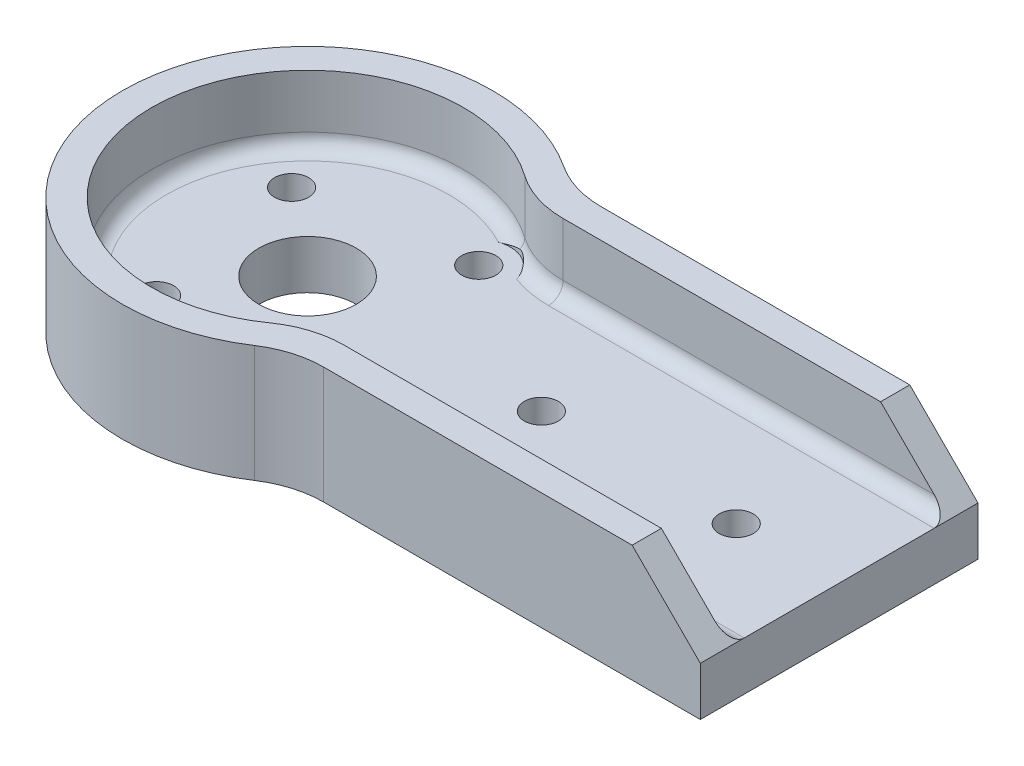
ISO-10303-21;
HEADER;
FILE_DESCRIPTION(('STEP AP214'),'2;1');
FILE_NAME('part.step','',(''),(''),'','','');
FILE_SCHEMA(('AUTOMOTIVE_DESIGN { 1 0 10303 214 1 1 1 1 }'));
ENDSEC;
DATA;
#1=APPLICATION_CONTEXT('core data for automotive mechanical design processes');
#2=APPLICATION_PROTOCOL_DEFINITION('international standard','automotive_design',2000,#1);
#3=PRODUCT_CONTEXT('',#1,'mechanical');
#4=PRODUCT('Part','Part','',(#3));
#5=PRODUCT_RELATED_PRODUCT_CATEGORY('part','',(#4));
#6=PRODUCT_DEFINITION_FORMATION('','',#4);
#7=PRODUCT_DEFINITION_CONTEXT('part definition',#1,'design');
#8=PRODUCT_DEFINITION('design','',#6,#7);
#9=PRODUCT_DEFINITION_SHAPE('','',#8);
#10=(LENGTH_UNIT() NAMED_UNIT(*) SI_UNIT(.MILLI.,.METRE.));
#11=(NAMED_UNIT(*) PLANE_ANGLE_UNIT() SI_UNIT($,.RADIAN.));
#12=(NAMED_UNIT(*) SI_UNIT($,.STERADIAN.) SOLID_ANGLE_UNIT());
#13=UNCERTAINTY_MEASURE_WITH_UNIT(LENGTH_MEASURE(1.E-05),#10,'distance_accuracy_value','');
#14=(GEOMETRIC_REPRESENTATION_CONTEXT(3) GLOBAL_UNCERTAINTY_ASSIGNED_CONTEXT((#13)) GLOBAL_UNIT_ASSIGNED_CONTEXT((#10,
#11,#12)) REPRESENTATION_CONTEXT('',''));
#15=CARTESIAN_POINT('',(0.,0.,0.));
#16=DIRECTION('',(0.,0.,1.));
#17=DIRECTION('',(1.,0.,0.));
#18=AXIS2_PLACEMENT_3D('',#15,#16,#17);
#19=CARTESIAN_POINT('',(14.9812382665787,6.5,-21.25));
#20=DIRECTION('',(0.,1.,0.));
#21=DIRECTION('',(0.,0.,1.));
#22=AXIS2_PLACEMENT_3D('',#19,#20,#21);
#23=TOROIDAL_SURFACE('',#22,11.5,1.5);
#24=CARTESIAN_POINT('',(11.0722439174272,5.14642049521173,-9.7498));
#25=CARTESIAN_POINT('',(11.0722551961008,5.12817830638219,-9.79011848867546));
#26=CARTESIAN_POINT('',(11.0714989703206,5.11171195343398,-9.83122690485633));
#27=CARTESIAN_POINT('',(11.0683393576506,5.08229249876614,-9.91458229134633));
#28=CARTESIAN_POINT('',(11.0659374034548,5.06933635490204,-9.9568282406654));
#29=CARTESIAN_POINT('',(11.0594020149385,5.04696123557071,-10.0417326809035));
#30=CARTESIAN_POINT('',(11.0552832170315,5.0375136073061,-10.0843847746103));
#31=CARTESIAN_POINT('',(11.0452714001229,5.0218686331396,-10.1700699045475));
#32=CARTESIAN_POINT('',(11.0393780799411,5.0156718394747,-10.2131030042398));
#33=CARTESIAN_POINT('',(11.0190493711127,5.00173391205888,-10.341989855795));
#34=CARTESIAN_POINT('',(11.0019409437119,4.99856323056397,-10.4279569643731));
#35=CARTESIAN_POINT('',(10.9608930637599,5.00262134556448,-10.5979860009344));
#36=CARTESIAN_POINT('',(10.9369431975972,5.00986606404966,-10.6820448120496));
#37=CARTESIAN_POINT('',(10.8663466825386,5.03961882302558,-10.8968699424602));
#38=CARTESIAN_POINT('',(10.8147388852321,5.06871370867024,-11.0250903522654));
#39=CARTESIAN_POINT('',(10.6974210901145,5.14041657930096,-11.2714120830588));
#40=CARTESIAN_POINT('',(10.6316279304076,5.18310499244215,-11.3894477218864));
#41=CARTESIAN_POINT('',(10.5101496453275,5.25991035197583,-11.5792132850456));
#42=CARTESIAN_POINT('',(10.4578366477459,5.29247527858474,-11.653792461489));
#43=CARTESIAN_POINT('',(10.3471221501715,5.35782441905683,-11.7983638600736));
#44=CARTESIAN_POINT('',(10.2887135259105,5.3906088466381,-11.8683505556427));
#45=CARTESIAN_POINT('',(10.1660189116357,5.45295263948425,-12.0033250331124));
#46=CARTESIAN_POINT('',(10.1017874798383,5.48253719671397,-12.0683504599357));
#47=CARTESIAN_POINT('',(9.96653784784571,5.53465825490824,-12.1939664263962));
#48=CARTESIAN_POINT('',(9.89553516640354,5.55721038931196,-12.2545665704557));
#49=CARTESIAN_POINT('',(9.77998752670991,5.58305414062454,-12.3447005082925));
#50=CARTESIAN_POINT('',(9.73776815005479,5.59044991783461,-12.3760342114577));
#51=CARTESIAN_POINT('',(9.65148982459086,5.60093791997458,-12.4368460519725));
#52=CARTESIAN_POINT('',(9.60743126557728,5.60403105208264,-12.4663245792193));
#53=CARTESIAN_POINT('',(9.51789020273415,5.60558561008889,-12.5231013747702));
#54=CARTESIAN_POINT('',(9.47240868663771,5.60405018124155,-12.5504011106896));
#55=CARTESIAN_POINT('',(9.3804511586046,5.59652680816897,-12.6025935933562));
#56=CARTESIAN_POINT('',(9.33397493014128,5.59053788474388,-12.6274858093963));
#57=CARTESIAN_POINT('',(9.16570651330277,5.56198765392071,-12.7124495837585));
#58=CARTESIAN_POINT('',(9.04210870517434,5.52823237926301,-12.7652532407224));
#59=CARTESIAN_POINT('',(8.85552543309019,5.46848038355663,-12.832087263231));
#60=CARTESIAN_POINT('',(8.79294423479313,5.44696503302771,-12.8523452339336));
#61=CARTESIAN_POINT('',(8.66718558265509,5.40234605226796,-12.8889242084795));
#62=CARTESIAN_POINT('',(8.60400844764643,5.37924323390982,-12.9052472057953));
#63=CARTESIAN_POINT('',(8.50963078771791,5.34463746514874,-12.9266335967279));
#64=CARTESIAN_POINT('',(8.47869548929778,5.33327956124583,-12.9331702714396));
#65=CARTESIAN_POINT('',(8.4167813307866,5.310642379409,-12.9453112585071));
#66=CARTESIAN_POINT('',(8.38580333205275,5.29936298063533,-12.9509197383446));
#67=CARTESIAN_POINT('',(8.35472134097655,5.28815366217246,-12.9560829371624));
#68=B_SPLINE_CURVE_WITH_KNOTS('',3,(#24,#25,#26,#27,#28,#29,#30,#31,#32,#33,#34,#35,#36,#37,#38,
#39,#40,#41,#42,#43,#44,#45,#46,#47,#48,#49,#50,#51,#52,#53,#54,#55,#56,#57,#58,#59,#60,#61,#62,
#63,#64,#65,#66,#67),.UNSPECIFIED.,.F.,.F.,(4,2,2,2,2,2,2,2,2,2,2,2,2,2,2,2,2,2,2,2,2,4),(0.,
0.132692918334424,0.265270466970811,0.39674016360757,0.528232186491525,0.790218054714842,
1.05260484603921,1.47390875747717,1.89775319815351,2.18771095243267,2.47801147304167,
2.76582836544833,3.05300078788183,3.21207751632181,3.3711206996254,3.53005583239267,
3.68902592092127,4.1017419984032,4.30934594532941,4.51684449723854,4.61762553058057,
4.7179410146354),.UNSPECIFIED.);
#69=CARTESIAN_POINT('',(10.9928998139801,5.,-10.4637515146589));
#70=VERTEX_POINT('',#69);
#71=CARTESIAN_POINT('',(9.00725589943939,5.51598613365082,-12.7762595092081));
#72=VERTEX_POINT('',#71);
#73=EDGE_CURVE('E159',#70,#72,#68,.T.);
#74=ORIENTED_EDGE('',*,*,#73,.F.);
#75=CARTESIAN_POINT('',(14.9812382665787,5.,-21.25));
#76=DIRECTION('',(0.,1.,0.));
#77=DIRECTION('',(0.,0.,1.));
#78=AXIS2_PLACEMENT_3D('',#75,#76,#77);
#79=CIRCLE('',#78,11.5);
#80=CARTESIAN_POINT('',(14.9812382665787,5.,-9.74999999999999));
#81=VERTEX_POINT('',#80);
#82=EDGE_CURVE('E170',#81,#70,#79,.F.);
#83=ORIENTED_EDGE('',*,*,#82,.F.);
#84=CARTESIAN_POINT('',(14.9812382665787,6.5,-9.74999999999999));
#85=DIRECTION('',(1.,0.,0.));
#86=DIRECTION('',(0.,0.,-1.));
#87=AXIS2_PLACEMENT_3D('',#84,#85,#86);
#88=CIRCLE('',#87,1.5);
#89=CARTESIAN_POINT('',(14.9812382665787,6.5,-11.25));
#90=VERTEX_POINT('',#89);
#91=EDGE_CURVE('E207',#81,#90,#88,.T.);
#92=ORIENTED_EDGE('',*,*,#91,.T.);
#93=CARTESIAN_POINT('',(14.9812382665787,6.5,-21.25));
#94=DIRECTION('',(0.,1.,0.));
#95=DIRECTION('',(0.,0.,1.));
#96=AXIS2_PLACEMENT_3D('',#93,#94,#95);
#97=CIRCLE('',#96,10.);
#98=CARTESIAN_POINT('',(9.21922354866378,6.5,-13.0769230769231));
#99=VERTEX_POINT('',#98);
#100=EDGE_CURVE('E196',#99,#90,#97,.T.);
#101=ORIENTED_EDGE('',*,*,#100,.F.);
#102=CARTESIAN_POINT('',(8.35492134097656,6.5,-11.8509615384615));
#103=DIRECTION('',(0.817307692307692,0.,0.576201471791487));
#104=DIRECTION('',(0.576201471791487,0.,-0.817307692307692));
#105=AXIS2_PLACEMENT_3D('',#102,#103,#104);
#106=CIRCLE('',#105,1.5);
#107=EDGE_CURVE('E172',#72,#99,#106,.T.);
#108=ORIENTED_EDGE('',*,*,#107,.F.);
#109=EDGE_LOOP('',(#74,#83,#92,#101,#108));
#110=FACE_BOUND('',#109,.T.);
#111=ADVANCED_FACE('F37',(#110),#23,.F.);
#112=CARTESIAN_POINT('',(0.,6.5,0.));
#113=DIRECTION('',(0.,1.,0.));
#114=DIRECTION('',(0.,0.,1.));
#115=AXIS2_PLACEMENT_3D('',#112,#113,#114);
#116=TOROIDAL_SURFACE('',#115,14.5,1.5);
#117=CARTESIAN_POINT('',(9.21942354866379,5.57507245928089,-12.684346451129));
#118=CARTESIAN_POINT('',(9.13786806168468,5.55389722238251,-12.7231588761133));
#119=CARTESIAN_POINT('',(9.05527810348355,5.53039346014796,-12.7583334001135));
#120=CARTESIAN_POINT('',(8.88828375072956,5.48051888445208,-12.8214905016335));
#121=CARTESIAN_POINT('',(8.80388047333892,5.45414979781876,-12.8494773770551));
#122=CARTESIAN_POINT('',(8.63243942496505,5.39999654672392,-12.8986694487097));
#123=CARTESIAN_POINT('',(8.54538255121528,5.37219963286265,-12.9197932906835));
#124=CARTESIAN_POINT('',(8.36971709543827,5.31689036436951,-12.9548083169053));
#125=CARTESIAN_POINT('',(8.28110826076299,5.28937805725119,-12.9686983120083));
#126=CARTESIAN_POINT('',(8.09980622387119,5.23509011428343,-12.9894502947654));
#127=CARTESIAN_POINT('',(8.00707148728976,5.20836362935777,-12.996081470544));
#128=CARTESIAN_POINT('',(7.82053075861663,5.15790381461554,-13.001338718818));
#129=CARTESIAN_POINT('',(7.72672458098127,5.13417101206152,-12.9999633831716));
#130=CARTESIAN_POINT('',(7.5390695211161,5.09121633791186,-12.9889958056236));
#131=CARTESIAN_POINT('',(7.44522364073335,5.0719706553163,-12.9794482538247));
#132=CARTESIAN_POINT('',(7.25778302429744,5.03936684803771,-12.9520067286634));
#133=CARTESIAN_POINT('',(7.16418814350747,5.02600379181012,-12.9341197724258));
#134=CARTESIAN_POINT('',(6.9639789599477,5.00541951697016,-12.8865589014567));
#135=CARTESIAN_POINT('',(6.85754977824341,4.99944169278959,-12.8555059481958));
#136=CARTESIAN_POINT('',(6.6484679716934,5.00063858857448,-12.7826489634635));
#137=CARTESIAN_POINT('',(6.54581187438802,5.00780088965887,-12.7408551154328));
#138=CARTESIAN_POINT('',(6.36348673916811,5.03597290931549,-12.6556740430819));
#139=CARTESIAN_POINT('',(6.28280369186867,5.05452688679295,-12.613664790442));
#140=CARTESIAN_POINT('',(6.12827863649279,5.10474064593233,-12.5250486061507));
#141=CARTESIAN_POINT('',(6.0544331614956,5.13639374079589,-12.4784440295394));
#142=CARTESIAN_POINT('',(5.91531355889419,5.21402970271994,-12.3831115271183));
#143=CARTESIAN_POINT('',(5.85009732028864,5.26010299502659,-12.3343719195673));
#144=CARTESIAN_POINT('',(5.73069722928897,5.36633565385306,-12.2387333201086));
#145=CARTESIAN_POINT('',(5.67650848834245,5.4264887531736,-12.1918335200796));
#146=CARTESIAN_POINT('',(5.58565100547167,5.55188563992245,-12.1087129584181));
#147=CARTESIAN_POINT('',(5.54769966134891,5.61580434448078,-12.0718844521812));
#148=CARTESIAN_POINT('',(5.48153394042123,5.75182294104021,-12.0051700871894));
#149=CARTESIAN_POINT('',(5.45332163875946,5.82392457227222,-11.975285708495));
#150=CARTESIAN_POINT('',(5.40725976766872,5.97176643225928,-11.9251960827327));
#151=CARTESIAN_POINT('',(5.38911513525881,6.04732369787488,-11.9047186562468));
#152=CARTESIAN_POINT('',(5.36165331737755,6.20187226364998,-11.873307812124));
#153=CARTESIAN_POINT('',(5.35232204535839,6.28085787212025,-11.8623591666777));
#154=CARTESIAN_POINT('',(5.34583860230095,6.38363413333117,-11.8547368746773));
#155=CARTESIAN_POINT('',(5.34474060981552,6.4069348371049,-11.8534441576859));
#156=CARTESIAN_POINT('',(5.34328051795888,6.4535540515125,-11.8517238127637));
#157=CARTESIAN_POINT('',(5.34291725063226,6.47687247484397,-11.8512948118323));
#158=CARTESIAN_POINT('',(5.34291855656469,6.5002,-11.8512962010315));
#159=B_SPLINE_CURVE_WITH_KNOTS('',3,(#117,#118,#119,#120,#121,#122,#123,#124,#125,#126,#127,
#128,#129,#130,#131,#132,#133,#134,#135,#136,#137,#138,#139,#140,#141,#142,#143,#144,#145,#146,
#147,#148,#149,#150,#151,#152,#153,#154,#155,#156,#157,#158),.UNSPECIFIED.,.F.,.F.,(4,2,2,2,2,2,
2,2,2,2,2,2,2,2,2,2,2,2,2,2,4),(0.,0.278087768961242,0.556008864305146,0.837113462285735,
1.11826425542758,1.4081163014792,1.69801932667702,1.98634706029764,2.27443261951711,
2.60633809526094,2.93793004496756,3.21530212476917,3.49253278681676,3.77153794838322,
4.05041915464157,4.29806017829007,4.54575393544302,4.78574242463238,5.02534668366831,
5.09541551268176,5.16537286899963),.UNSPECIFIED.);
#160=CARTESIAN_POINT('',(6.76721875683803,5.,-12.8239911999775));
#161=VERTEX_POINT('',#160);
#162=EDGE_CURVE('E161',#72,#161,#159,.T.);
#163=ORIENTED_EDGE('',*,*,#162,.F.);
#164=ORIENTED_EDGE('',*,*,#107,.T.);
#165=CARTESIAN_POINT('',(0.,6.5,0.));
#166=DIRECTION('',(0.,1.,0.));
#167=DIRECTION('',(0.,0.,1.));
#168=AXIS2_PLACEMENT_3D('',#165,#166,#167);
#169=CIRCLE('',#168,16.);
#170=CARTESIAN_POINT('',(9.21922354866378,6.5,13.0769230769231));
#171=VERTEX_POINT('',#170);
#172=EDGE_CURVE('E198',#171,#99,#169,.F.);
#173=ORIENTED_EDGE('',*,*,#172,.F.);
#174=CARTESIAN_POINT('',(8.35492134097655,6.5,11.8509615384615));
#175=DIRECTION('',(-0.817307692307692,0.,0.576201471791486));
#176=DIRECTION('',(0.576201471791486,0.,0.817307692307692));
#177=AXIS2_PLACEMENT_3D('',#174,#175,#176);
#178=CIRCLE('',#177,1.5);
#179=CARTESIAN_POINT('',(8.35492134097655,5.,11.8509615384615));
#180=VERTEX_POINT('',#179);
#181=EDGE_CURVE('E203',#180,#171,#178,.T.);
#182=ORIENTED_EDGE('',*,*,#181,.F.);
#183=CARTESIAN_POINT('',(0.,5.,0.));
#184=DIRECTION('',(0.,1.,0.));
#185=DIRECTION('',(0.,0.,1.));
#186=AXIS2_PLACEMENT_3D('',#183,#184,#185);
#187=CIRCLE('',#186,14.5);
#188=EDGE_CURVE('E180',#161,#180,#187,.T.);
#189=ORIENTED_EDGE('',*,*,#188,.F.);
#190=EDGE_LOOP('',(#163,#164,#173,#182,#189));
#191=FACE_BOUND('',#190,.T.);
#192=ADVANCED_FACE('F218',(#191),#116,.F.);
#193=CARTESIAN_POINT('',(54.5673187275568,5.,-14.25));
#194=DIRECTION('',(-1.,0.,0.));
#195=DIRECTION('',(0.,0.,1.));
#196=AXIS2_PLACEMENT_3D('',#193,#194,#195);
#197=PLANE('',#196);
#198=DIRECTION('',(0.,0.,-1.));
#199=VECTOR('',#198,1.);
#200=CARTESIAN_POINT('',(54.5673187275568,5.,-14.25));
#201=LINE('',#200,#199);
#202=CARTESIAN_POINT('',(54.5673187275568,5.,9.75));
#203=VERTEX_POINT('',#202);
#204=CARTESIAN_POINT('',(54.5673187275568,5.,-9.75));
#205=VERTEX_POINT('',#204);
#206=EDGE_CURVE('E340',#203,#205,#201,.T.);
#207=ORIENTED_EDGE('',*,*,#206,.F.);
#208=DIRECTION('',(0.,0.,1.));
#209=VECTOR('',#208,1.);
#210=CARTESIAN_POINT('',(54.5673187275568,4.99999999999997,14.25));
#211=LINE('',#210,#209);
#212=CARTESIAN_POINT('',(54.5673187275568,4.99999999999997,14.25));
#213=VERTEX_POINT('',#212);
#214=EDGE_CURVE('E59',#203,#213,#211,.T.);
#215=ORIENTED_EDGE('',*,*,#214,.T.);
#216=DIRECTION('',(0.,-1.,0.));
#217=VECTOR('',#216,1.);
#218=CARTESIAN_POINT('',(54.5673187275568,5.,14.25));
#219=LINE('',#218,#217);
#220=CARTESIAN_POINT('',(54.5673187275568,0.,14.25));
#221=VERTEX_POINT('',#220);
#222=EDGE_CURVE('E342',#213,#221,#219,.T.);
#223=ORIENTED_EDGE('',*,*,#222,.T.);
#224=DIRECTION('',(0.,0.,-1.));
#225=VECTOR('',#224,1.);
#226=CARTESIAN_POINT('',(54.5673187275568,0.,-14.25));
#227=LINE('',#226,#225);
#228=CARTESIAN_POINT('',(54.5673187275568,0.,-14.25));
#229=VERTEX_POINT('',#228);
#230=EDGE_CURVE('E337',#221,#229,#227,.T.);
#231=ORIENTED_EDGE('',*,*,#230,.T.);
#232=DIRECTION('',(0.,-1.,0.));
#233=VECTOR('',#232,1.);
#234=CARTESIAN_POINT('',(54.5673187275568,5.,-14.25));
#235=LINE('',#234,#233);
#236=CARTESIAN_POINT('',(54.5673187275568,4.99999999999997,-14.25));
#237=VERTEX_POINT('',#236);
#238=EDGE_CURVE('E354',#237,#229,#235,.T.);
#239=ORIENTED_EDGE('',*,*,#238,.F.);
#240=DIRECTION('',(0.,0.,1.));
#241=VECTOR('',#240,1.);
#242=CARTESIAN_POINT('',(54.5673187275568,4.99999999999997,-11.25));
#243=LINE('',#242,#241);
#244=EDGE_CURVE('E260',#237,#205,#243,.T.);
#245=ORIENTED_EDGE('',*,*,#244,.T.);
#246=EDGE_LOOP('',(#207,#215,#223,#231,#239,#245));
#247=FACE_BOUND('',#246,.T.);
#248=ADVANCED_FACE('F413',(#247),#197,.F.);
#249=CARTESIAN_POINT('',(12.5673187275568,5.,-14.25));
#250=DIRECTION('',(0.,0.,1.));
#251=DIRECTION('',(1.,0.,0.));
#252=AXIS2_PLACEMENT_3D('',#249,#250,#251);
#253=PLANE('',#252);
#254=DIRECTION('',(-1.,0.,0.));
#255=VECTOR('',#254,1.);
#256=CARTESIAN_POINT('',(54.5673187275568,12.,-14.25));
#257=LINE('',#256,#255);
#258=CARTESIAN_POINT('',(47.5673187275568,12.,-14.25));
#259=VERTEX_POINT('',#258);
#260=CARTESIAN_POINT('',(15.9040089285689,12.,-14.25));
#261=VERTEX_POINT('',#260);
#262=EDGE_CURVE('E209',#259,#261,#257,.T.);
#263=ORIENTED_EDGE('',*,*,#262,.F.);
#264=DIRECTION('',(0.707106781186546,-0.707106781186549,0.));
#265=VECTOR('',#264,1.);
#266=CARTESIAN_POINT('',(47.5673187275568,12.,-14.25));
#267=LINE('',#266,#265);
#268=EDGE_CURVE('E257',#259,#237,#267,.T.);
#269=ORIENTED_EDGE('',*,*,#268,.T.);
#270=ORIENTED_EDGE('',*,*,#238,.T.);
#271=DIRECTION('',(-1.,0.,0.));
#272=VECTOR('',#271,1.);
#273=CARTESIAN_POINT('',(12.5673187275568,0.,-14.25));
#274=LINE('',#273,#272);
#275=CARTESIAN_POINT('',(15.9040089285689,0.,-14.25));
#276=VERTEX_POINT('',#275);
#277=EDGE_CURVE('E346',#229,#276,#274,.T.);
#278=ORIENTED_EDGE('',*,*,#277,.T.);
#279=DIRECTION('',(0.,1.,0.));
#280=VECTOR('',#279,1.);
#281=CARTESIAN_POINT('',(15.9040089285689,12.,-14.25));
#282=LINE('',#281,#280);
#283=EDGE_CURVE('E282',#276,#261,#282,.T.);
#284=ORIENTED_EDGE('',*,*,#283,.T.);
#285=EDGE_LOOP('',(#263,#269,#270,#278,#284));
#286=FACE_BOUND('',#285,.T.);
#287=ADVANCED_FACE('F278',(#286),#253,.F.);
#288=CARTESIAN_POINT('',(0.,5.,0.));
#289=DIRECTION('',(0.,-1.,0.));
#290=DIRECTION('',(0.,0.,-1.));
#291=AXIS2_PLACEMENT_3D('',#288,#289,#290);
#292=CYLINDRICAL_SURFACE('',#291,19.);
#293=CARTESIAN_POINT('',(0.,12.,0.));
#294=DIRECTION('',(0.,1.,0.));
#295=DIRECTION('',(0.,0.,1.));
#296=AXIS2_PLACEMENT_3D('',#293,#294,#295);
#297=CIRCLE('',#296,19.);
#298=CARTESIAN_POINT('',(10.4198679187176,12.,-15.8879310344828));
#299=VERTEX_POINT('',#298);
#300=CARTESIAN_POINT('',(10.4198679187176,12.,15.8879310344828));
#301=VERTEX_POINT('',#300);
#302=EDGE_CURVE('E284',#299,#301,#297,.T.);
#303=ORIENTED_EDGE('',*,*,#302,.F.);
#304=DIRECTION('',(0.,-1.,0.));
#305=VECTOR('',#304,1.);
#306=CARTESIAN_POINT('',(10.4198679187176,5.,-15.8879310344828));
#307=LINE('',#306,#305);
#308=CARTESIAN_POINT('',(10.4198679187176,0.,-15.8879310344828));
#309=VERTEX_POINT('',#308);
#310=EDGE_CURVE('E358',#299,#309,#307,.T.);
#311=ORIENTED_EDGE('',*,*,#310,.T.);
#312=CARTESIAN_POINT('',(0.,0.,0.));
#313=DIRECTION('',(0.,1.,0.));
#314=DIRECTION('',(0.,0.,1.));
#315=AXIS2_PLACEMENT_3D('',#312,#313,#314);
#316=CIRCLE('',#315,19.);
#317=CARTESIAN_POINT('',(10.4198679187176,0.,15.8879310344828));
#318=VERTEX_POINT('',#317);
#319=EDGE_CURVE('E348',#309,#318,#316,.T.);
#320=ORIENTED_EDGE('',*,*,#319,.T.);
#321=DIRECTION('',(0.,-1.,0.));
#322=VECTOR('',#321,1.);
#323=CARTESIAN_POINT('',(10.4198679187176,5.,15.8879310344828));
#324=LINE('',#323,#322);
#325=EDGE_CURVE('E356',#318,#301,#324,.F.);
#326=ORIENTED_EDGE('',*,*,#325,.T.);
#327=EDGE_LOOP('',(#303,#311,#320,#326));
#328=FACE_BOUND('',#327,.T.);
#329=ADVANCED_FACE('F423',(#328),#292,.T.);
#330=CARTESIAN_POINT('',(12.5673187275568,5.,14.25));
#331=DIRECTION('',(0.,0.,-1.));
#332=DIRECTION('',(-1.,0.,0.));
#333=AXIS2_PLACEMENT_3D('',#330,#331,#332);
#334=PLANE('',#333);
#335=ORIENTED_EDGE('',*,*,#222,.F.);
#336=DIRECTION('',(-0.707106781186546,0.707106781186549,0.));
#337=VECTOR('',#336,1.);
#338=CARTESIAN_POINT('',(47.5673187275568,12.,14.25));
#339=LINE('',#338,#337);
#340=CARTESIAN_POINT('',(47.5673187275568,12.,14.25));
#341=VERTEX_POINT('',#340);
#342=EDGE_CURVE('E250',#213,#341,#339,.T.);
#343=ORIENTED_EDGE('',*,*,#342,.T.);
#344=DIRECTION('',(1.,0.,0.));
#345=VECTOR('',#344,1.);
#346=CARTESIAN_POINT('',(54.5673187275568,12.,14.25));
#347=LINE('',#346,#345);
#348=CARTESIAN_POINT('',(15.9040089285689,12.,14.25));
#349=VERTEX_POINT('',#348);
#350=EDGE_CURVE('E286',#349,#341,#347,.T.);
#351=ORIENTED_EDGE('',*,*,#350,.F.);
#352=DIRECTION('',(0.,1.,0.));
#353=VECTOR('',#352,1.);
#354=CARTESIAN_POINT('',(15.9040089285689,0.,14.25));
#355=LINE('',#354,#353);
#356=CARTESIAN_POINT('',(15.9040089285689,0.,14.25));
#357=VERTEX_POINT('',#356);
#358=EDGE_CURVE('E362',#349,#357,#355,.F.);
#359=ORIENTED_EDGE('',*,*,#358,.T.);
#360=DIRECTION('',(1.,0.,0.));
#361=VECTOR('',#360,1.);
#362=CARTESIAN_POINT('',(12.5673187275568,0.,14.25));
#363=LINE('',#362,#361);
#364=EDGE_CURVE('E343',#357,#221,#363,.T.);
#365=ORIENTED_EDGE('',*,*,#364,.T.);
#366=EDGE_LOOP('',(#335,#343,#351,#359,#365));
#367=FACE_BOUND('',#366,.T.);
#368=ADVANCED_FACE('F478',(#367),#334,.F.);
#369=CARTESIAN_POINT('',(0.,5.,0.));
#370=DIRECTION('',(0.,1.,0.));
#371=DIRECTION('',(0.,0.,1.));
#372=AXIS2_PLACEMENT_3D('',#369,#370,#371);
#373=PLANE('',#372);
#374=ORIENTED_EDGE('',*,*,#82,.T.);
#375=CARTESIAN_POINT('',(7.82224392358101,5.,-9.75));
#376=DIRECTION('',(0.,1.,0.));
#377=DIRECTION('',(0.,0.,1.));
#378=AXIS2_PLACEMENT_3D('',#375,#376,#377);
#379=CIRCLE('',#378,3.25);
#380=EDGE_CURVE('E156',#70,#161,#379,.T.);
#381=ORIENTED_EDGE('',*,*,#380,.T.);
#382=ORIENTED_EDGE('',*,*,#188,.T.);
#383=CARTESIAN_POINT('',(14.9812382665786,5.,21.25));
#384=DIRECTION('',(0.,1.,0.));
#385=DIRECTION('',(0.,0.,1.));
#386=AXIS2_PLACEMENT_3D('',#383,#384,#385);
#387=CIRCLE('',#386,11.5);
#388=CARTESIAN_POINT('',(14.9812382665786,5.,9.75));
#389=VERTEX_POINT('',#388);
#390=EDGE_CURVE('E182',#180,#389,#387,.F.);
#391=ORIENTED_EDGE('',*,*,#390,.T.);
#392=DIRECTION('',(-1.,0.,0.));
#393=VECTOR('',#392,1.);
#394=CARTESIAN_POINT('',(0.,5.,9.75000000000001));
#395=LINE('',#394,#393);
#396=EDGE_CURVE('E189',#389,#203,#395,.F.);
#397=ORIENTED_EDGE('',*,*,#396,.T.);
#398=ORIENTED_EDGE('',*,*,#206,.T.);
#399=DIRECTION('',(1.,0.,0.));
#400=VECTOR('',#399,1.);
#401=CARTESIAN_POINT('',(0.,5.,-9.74999999999999));
#402=LINE('',#401,#400);
#403=EDGE_CURVE('E178',#205,#81,#402,.F.);
#404=ORIENTED_EDGE('',*,*,#403,.T.);
#405=EDGE_LOOP('',(#374,#381,#382,#391,#397,#398,#404));
#406=FACE_BOUND('',#405,.T.);
#407=CARTESIAN_POINT('',(44.,5.,0.));
#408=DIRECTION('',(0.,1.,0.));
#409=DIRECTION('',(0.,0.,1.));
#410=AXIS2_PLACEMENT_3D('',#407,#408,#409);
#411=CIRCLE('',#410,1.75);
#412=CARTESIAN_POINT('',(44.,5.,1.75));
#413=VERTEX_POINT('',#412);
#414=EDGE_CURVE('E297',#413,#413,#411,.T.);
#415=ORIENTED_EDGE('',*,*,#414,.F.);
#416=EDGE_LOOP('',(#415));
#417=FACE_BOUND('',#416,.T.);
#418=CARTESIAN_POINT('',(24.,5.,0.));
#419=DIRECTION('',(0.,1.,0.));
#420=DIRECTION('',(0.,0.,1.));
#421=AXIS2_PLACEMENT_3D('',#418,#419,#420);
#422=CIRCLE('',#421,1.75);
#423=CARTESIAN_POINT('',(24.,5.,1.75));
#424=VERTEX_POINT('',#423);
#425=EDGE_CURVE('E301',#424,#424,#422,.T.);
#426=ORIENTED_EDGE('',*,*,#425,.F.);
#427=EDGE_LOOP('',(#426));
#428=FACE_BOUND('',#427,.T.);
#429=CARTESIAN_POINT('',(0.,5.,0.));
#430=DIRECTION('',(0.,1.,0.));
#431=DIRECTION('',(0.,0.,1.));
#432=AXIS2_PLACEMENT_3D('',#429,#430,#431);
#433=CIRCLE('',#432,5.);
#434=CARTESIAN_POINT('',(0.,5.,5.));
#435=VERTEX_POINT('',#434);
#436=EDGE_CURVE('E331',#435,#435,#433,.T.);
#437=ORIENTED_EDGE('',*,*,#436,.F.);
#438=EDGE_LOOP('',(#437));
#439=FACE_BOUND('',#438,.T.);
#440=CARTESIAN_POINT('',(-8.71008605954415,5.,-7.07224392358051));
#441=DIRECTION('',(0.,1.,0.));
#442=DIRECTION('',(0.,0.,1.));
#443=AXIS2_PLACEMENT_3D('',#440,#441,#442);
#444=CIRCLE('',#443,1.75);
#445=CARTESIAN_POINT('',(-8.71008605954415,5.,-5.32224392358051));
#446=VERTEX_POINT('',#445);
#447=EDGE_CURVE('E307',#446,#446,#444,.T.);
#448=ORIENTED_EDGE('',*,*,#447,.F.);
#449=EDGE_LOOP('',(#448));
#450=FACE_BOUND('',#449,.T.);
#451=CARTESIAN_POINT('',(-6.03232998312466,5.,9.46008605954466));
#452=DIRECTION('',(0.,1.,0.));
#453=DIRECTION('',(0.,0.,1.));
#454=AXIS2_PLACEMENT_3D('',#451,#452,#453);
#455=CIRCLE('',#454,1.75);
#456=CARTESIAN_POINT('',(-6.03232998312466,5.,11.2100860595447));
#457=VERTEX_POINT('',#456);
#458=EDGE_CURVE('E320',#457,#457,#455,.T.);
#459=ORIENTED_EDGE('',*,*,#458,.F.);
#460=EDGE_LOOP('',(#459));
#461=FACE_BOUND('',#460,.T.);
#462=CARTESIAN_POINT('',(10.5000000000005,5.,6.78232998312516));
#463=DIRECTION('',(0.,1.,0.));
#464=DIRECTION('',(0.,0.,1.));
#465=AXIS2_PLACEMENT_3D('',#462,#463,#464);
#466=CIRCLE('',#465,1.75);
#467=CARTESIAN_POINT('',(10.5000000000005,5.,8.53232998312516));
#468=VERTEX_POINT('',#467);
#469=EDGE_CURVE('E314',#468,#468,#466,.T.);
#470=ORIENTED_EDGE('',*,*,#469,.F.);
#471=EDGE_LOOP('',(#470));
#472=FACE_BOUND('',#471,.T.);
#473=CARTESIAN_POINT('',(7.82224392358101,5.,-9.75));
#474=DIRECTION('',(0.,1.,0.));
#475=DIRECTION('',(0.,0.,1.));
#476=AXIS2_PLACEMENT_3D('',#473,#474,#475);
#477=CIRCLE('',#476,1.75);
#478=CARTESIAN_POINT('',(7.82224392358101,5.,-8.));
#479=VERTEX_POINT('',#478);
#480=EDGE_CURVE('E313',#479,#479,#477,.T.);
#481=ORIENTED_EDGE('',*,*,#480,.F.);
#482=EDGE_LOOP('',(#481));
#483=FACE_BOUND('',#482,.T.);
#484=ADVANCED_FACE('F175',(#406,#417,#428,#439,#450,#461,#472,#483),#373,.T.);
#485=CARTESIAN_POINT('',(0.,0.,0.));
#486=DIRECTION('',(0.,1.,0.));
#487=DIRECTION('',(0.,0.,1.));
#488=AXIS2_PLACEMENT_3D('',#485,#486,#487);
#489=PLANE('',#488);
#490=CARTESIAN_POINT('',(44.,0.,0.));
#491=DIRECTION('',(0.,1.,0.));
#492=DIRECTION('',(0.,0.,1.));
#493=AXIS2_PLACEMENT_3D('',#490,#491,#492);
#494=CIRCLE('',#493,1.75);
#495=CARTESIAN_POINT('',(44.,0.,1.75));
#496=VERTEX_POINT('',#495);
#497=EDGE_CURVE('E298',#496,#496,#494,.T.);
#498=ORIENTED_EDGE('',*,*,#497,.T.);
#499=EDGE_LOOP('',(#498));
#500=FACE_BOUND('',#499,.T.);
#501=CARTESIAN_POINT('',(24.,0.,0.));
#502=DIRECTION('',(0.,1.,0.));
#503=DIRECTION('',(0.,0.,1.));
#504=AXIS2_PLACEMENT_3D('',#501,#502,#503);
#505=CIRCLE('',#504,1.75);
#506=CARTESIAN_POINT('',(24.,0.,1.75));
#507=VERTEX_POINT('',#506);
#508=EDGE_CURVE('E304',#507,#507,#505,.T.);
#509=ORIENTED_EDGE('',*,*,#508,.T.);
#510=EDGE_LOOP('',(#509));
#511=FACE_BOUND('',#510,.T.);
#512=CARTESIAN_POINT('',(10.5000000000005,0.,6.78232998312516));
#513=DIRECTION('',(0.,1.,0.));
#514=DIRECTION('',(0.,0.,1.));
#515=AXIS2_PLACEMENT_3D('',#512,#513,#514);
#516=CIRCLE('',#515,1.75);
#517=CARTESIAN_POINT('',(10.5000000000005,0.,8.53232998312516));
#518=VERTEX_POINT('',#517);
#519=EDGE_CURVE('E310',#518,#518,#516,.T.);
#520=ORIENTED_EDGE('',*,*,#519,.T.);
#521=EDGE_LOOP('',(#520));
#522=FACE_BOUND('',#521,.T.);
#523=CARTESIAN_POINT('',(-6.03232998312466,0.,9.46008605954466));
#524=DIRECTION('',(0.,1.,0.));
#525=DIRECTION('',(0.,0.,1.));
#526=AXIS2_PLACEMENT_3D('',#523,#524,#525);
#527=CIRCLE('',#526,1.75);
#528=CARTESIAN_POINT('',(-6.03232998312466,0.,11.2100860595447));
#529=VERTEX_POINT('',#528);
#530=EDGE_CURVE('E317',#529,#529,#527,.T.);
#531=ORIENTED_EDGE('',*,*,#530,.T.);
#532=EDGE_LOOP('',(#531));
#533=FACE_BOUND('',#532,.T.);
#534=CARTESIAN_POINT('',(-8.71008605954415,0.,-7.07224392358051));
#535=DIRECTION('',(0.,1.,0.));
#536=DIRECTION('',(0.,0.,1.));
#537=AXIS2_PLACEMENT_3D('',#534,#535,#536);
#538=CIRCLE('',#537,1.75);
#539=CARTESIAN_POINT('',(-8.71008605954415,0.,-5.32224392358051));
#540=VERTEX_POINT('',#539);
#541=EDGE_CURVE('E323',#540,#540,#538,.T.);
#542=ORIENTED_EDGE('',*,*,#541,.T.);
#543=EDGE_LOOP('',(#542));
#544=FACE_BOUND('',#543,.T.);
#545=CARTESIAN_POINT('',(7.82224392358101,0.,-9.75));
#546=DIRECTION('',(0.,1.,0.));
#547=DIRECTION('',(0.,0.,1.));
#548=AXIS2_PLACEMENT_3D('',#545,#546,#547);
#549=CIRCLE('',#548,1.75);
#550=CARTESIAN_POINT('',(7.82224392358101,0.,-8.));
#551=VERTEX_POINT('',#550);
#552=EDGE_CURVE('E328',#551,#551,#549,.T.);
#553=ORIENTED_EDGE('',*,*,#552,.T.);
#554=EDGE_LOOP('',(#553));
#555=FACE_BOUND('',#554,.T.);
#556=CARTESIAN_POINT('',(0.,0.,0.));
#557=DIRECTION('',(0.,1.,0.));
#558=DIRECTION('',(0.,0.,1.));
#559=AXIS2_PLACEMENT_3D('',#556,#557,#558);
#560=CIRCLE('',#559,5.);
#561=CARTESIAN_POINT('',(0.,0.,5.));
#562=VERTEX_POINT('',#561);
#563=EDGE_CURVE('E334',#562,#562,#560,.T.);
#564=ORIENTED_EDGE('',*,*,#563,.T.);
#565=EDGE_LOOP('',(#564));
#566=FACE_BOUND('',#565,.T.);
#567=ORIENTED_EDGE('',*,*,#230,.F.);
#568=ORIENTED_EDGE('',*,*,#364,.F.);
#569=CARTESIAN_POINT('',(15.9040089285689,0.,24.25));
#570=DIRECTION('',(0.,1.,0.));
#571=DIRECTION('',(0.,0.,1.));
#572=AXIS2_PLACEMENT_3D('',#569,#570,#571);
#573=CIRCLE('',#572,10.);
#574=EDGE_CURVE('E369',#357,#318,#573,.T.);
#575=ORIENTED_EDGE('',*,*,#574,.T.);
#576=ORIENTED_EDGE('',*,*,#319,.F.);
#577=CARTESIAN_POINT('',(15.9040089285689,0.,-24.25));
#578=DIRECTION('',(0.,1.,0.));
#579=DIRECTION('',(0.,0.,1.));
#580=AXIS2_PLACEMENT_3D('',#577,#578,#579);
#581=CIRCLE('',#580,10.);
#582=EDGE_CURVE('E365',#309,#276,#581,.T.);
#583=ORIENTED_EDGE('',*,*,#582,.T.);
#584=ORIENTED_EDGE('',*,*,#277,.F.);
#585=EDGE_LOOP('',(#567,#568,#575,#576,#583,#584));
#586=FACE_BOUND('',#585,.T.);
#587=ADVANCED_FACE('F492',(#500,#511,#522,#533,#544,#555,#566,#586),#489,.F.);
#588=CARTESIAN_POINT('',(0.,0.,0.));
#589=DIRECTION('',(0.,1.,0.));
#590=DIRECTION('',(0.,0.,1.));
#591=AXIS2_PLACEMENT_3D('',#588,#589,#590);
#592=CYLINDRICAL_SURFACE('',#591,5.);
#593=ORIENTED_EDGE('',*,*,#563,.F.);
#594=EDGE_LOOP('',(#593));
#595=FACE_BOUND('',#594,.T.);
#596=ORIENTED_EDGE('',*,*,#436,.T.);
#597=EDGE_LOOP('',(#596));
#598=FACE_BOUND('',#597,.T.);
#599=ADVANCED_FACE('F567',(#595,#598),#592,.F.);
#600=CARTESIAN_POINT('',(7.82224392358101,0.,-9.75));
#601=DIRECTION('',(0.,1.,0.));
#602=DIRECTION('',(0.,0.,1.));
#603=AXIS2_PLACEMENT_3D('',#600,#601,#602);
#604=CYLINDRICAL_SURFACE('',#603,1.75);
#605=ORIENTED_EDGE('',*,*,#552,.F.);
#606=EDGE_LOOP('',(#605));
#607=FACE_BOUND('',#606,.T.);
#608=ORIENTED_EDGE('',*,*,#480,.T.);
#609=EDGE_LOOP('',(#608));
#610=FACE_BOUND('',#609,.T.);
#611=ADVANCED_FACE('F625',(#607,#610),#604,.F.);
#612=CARTESIAN_POINT('',(-8.71008605954415,0.,-7.07224392358051));
#613=DIRECTION('',(0.,1.,0.));
#614=DIRECTION('',(0.,0.,1.));
#615=AXIS2_PLACEMENT_3D('',#612,#613,#614);
#616=CYLINDRICAL_SURFACE('',#615,1.75);
#617=ORIENTED_EDGE('',*,*,#541,.F.);
#618=EDGE_LOOP('',(#617));
#619=FACE_BOUND('',#618,.T.);
#620=ORIENTED_EDGE('',*,*,#447,.T.);
#621=EDGE_LOOP('',(#620));
#622=FACE_BOUND('',#621,.T.);
#623=ADVANCED_FACE('F615',(#619,#622),#616,.F.);
#624=CARTESIAN_POINT('',(-6.03232998312466,0.,9.46008605954466));
#625=DIRECTION('',(0.,1.,0.));
#626=DIRECTION('',(0.,0.,1.));
#627=AXIS2_PLACEMENT_3D('',#624,#625,#626);
#628=CYLINDRICAL_SURFACE('',#627,1.75);
#629=ORIENTED_EDGE('',*,*,#530,.F.);
#630=EDGE_LOOP('',(#629));
#631=FACE_BOUND('',#630,.T.);
#632=ORIENTED_EDGE('',*,*,#458,.T.);
#633=EDGE_LOOP('',(#632));
#634=FACE_BOUND('',#633,.T.);
#635=ADVANCED_FACE('F605',(#631,#634),#628,.F.);
#636=CARTESIAN_POINT('',(10.5000000000005,0.,6.78232998312516));
#637=DIRECTION('',(0.,1.,0.));
#638=DIRECTION('',(0.,0.,1.));
#639=AXIS2_PLACEMENT_3D('',#636,#637,#638);
#640=CYLINDRICAL_SURFACE('',#639,1.75);
#641=ORIENTED_EDGE('',*,*,#519,.F.);
#642=EDGE_LOOP('',(#641));
#643=FACE_BOUND('',#642,.T.);
#644=ORIENTED_EDGE('',*,*,#469,.T.);
#645=EDGE_LOOP('',(#644));
#646=FACE_BOUND('',#645,.T.);
#647=ADVANCED_FACE('F595',(#643,#646),#640,.F.);
#648=CARTESIAN_POINT('',(24.,0.,0.));
#649=DIRECTION('',(0.,1.,0.));
#650=DIRECTION('',(0.,0.,1.));
#651=AXIS2_PLACEMENT_3D('',#648,#649,#650);
#652=CYLINDRICAL_SURFACE('',#651,1.75);
#653=ORIENTED_EDGE('',*,*,#508,.F.);
#654=EDGE_LOOP('',(#653));
#655=FACE_BOUND('',#654,.T.);
#656=ORIENTED_EDGE('',*,*,#425,.T.);
#657=EDGE_LOOP('',(#656));
#658=FACE_BOUND('',#657,.T.);
#659=ADVANCED_FACE('F585',(#655,#658),#652,.F.);
#660=CARTESIAN_POINT('',(44.,0.,0.));
#661=DIRECTION('',(0.,1.,0.));
#662=DIRECTION('',(0.,0.,1.));
#663=AXIS2_PLACEMENT_3D('',#660,#661,#662);
#664=CYLINDRICAL_SURFACE('',#663,1.75);
#665=ORIENTED_EDGE('',*,*,#497,.F.);
#666=EDGE_LOOP('',(#665));
#667=FACE_BOUND('',#666,.T.);
#668=ORIENTED_EDGE('',*,*,#414,.T.);
#669=EDGE_LOOP('',(#668));
#670=FACE_BOUND('',#669,.T.);
#671=ADVANCED_FACE('F503',(#667,#670),#664,.F.);
#672=CARTESIAN_POINT('',(54.5673187275568,12.,11.25));
#673=DIRECTION('',(0.,0.,1.));
#674=DIRECTION('',(1.,0.,0.));
#675=AXIS2_PLACEMENT_3D('',#672,#673,#674);
#676=PLANE('',#675);
#677=DIRECTION('',(-1.,0.,0.));
#678=VECTOR('',#677,1.);
#679=CARTESIAN_POINT('',(54.5673187275568,12.,11.25));
#680=LINE('',#679,#678);
#681=CARTESIAN_POINT('',(47.5673187275568,12.,11.25));
#682=VERTEX_POINT('',#681);
#683=CARTESIAN_POINT('',(14.9812382665786,12.,11.25));
#684=VERTEX_POINT('',#683);
#685=EDGE_CURVE('E289',#682,#684,#680,.T.);
#686=ORIENTED_EDGE('',*,*,#685,.F.);
#687=DIRECTION('',(0.707106781186546,-0.707106781186549,0.));
#688=VECTOR('',#687,1.);
#689=CARTESIAN_POINT('',(47.5673187275568,12.,11.25));
#690=LINE('',#689,#688);
#691=CARTESIAN_POINT('',(53.0673187275568,6.5,11.25));
#692=VERTEX_POINT('',#691);
#693=EDGE_CURVE('E266',#682,#692,#690,.T.);
#694=ORIENTED_EDGE('',*,*,#693,.T.);
#695=DIRECTION('',(-1.,0.,0.));
#696=VECTOR('',#695,1.);
#697=CARTESIAN_POINT('',(54.5673187275568,6.5,11.25));
#698=LINE('',#697,#696);
#699=CARTESIAN_POINT('',(14.9812382665786,6.5,11.25));
#700=VERTEX_POINT('',#699);
#701=EDGE_CURVE('E184',#692,#700,#698,.T.);
#702=ORIENTED_EDGE('',*,*,#701,.T.);
#703=DIRECTION('',(0.,-1.,0.));
#704=VECTOR('',#703,1.);
#705=CARTESIAN_POINT('',(14.9812382665786,12.,11.25));
#706=LINE('',#705,#704);
#707=EDGE_CURVE('E385',#700,#684,#706,.F.);
#708=ORIENTED_EDGE('',*,*,#707,.T.);
#709=EDGE_LOOP('',(#686,#694,#702,#708));
#710=FACE_BOUND('',#709,.T.);
#711=ADVANCED_FACE('F389',(#710),#676,.F.);
#712=CARTESIAN_POINT('',(0.,12.,0.));
#713=DIRECTION('',(0.,-1.,0.));
#714=DIRECTION('',(0.,0.,-1.));
#715=AXIS2_PLACEMENT_3D('',#712,#713,#714);
#716=CYLINDRICAL_SURFACE('',#715,16.);
#717=DIRECTION('',(0.,-1.,0.));
#718=VECTOR('',#717,1.);
#719=CARTESIAN_POINT('',(9.21922354866378,12.,13.0769230769231));
#720=LINE('',#719,#718);
#721=CARTESIAN_POINT('',(9.21922354866378,12.,13.0769230769231));
#722=VERTEX_POINT('',#721);
#723=EDGE_CURVE('E376',#722,#171,#720,.T.);
#724=ORIENTED_EDGE('',*,*,#723,.T.);
#725=ORIENTED_EDGE('',*,*,#172,.T.);
#726=DIRECTION('',(0.,-1.,0.));
#727=VECTOR('',#726,1.);
#728=CARTESIAN_POINT('',(9.21922354866378,12.,-13.0769230769231));
#729=LINE('',#728,#727);
#730=CARTESIAN_POINT('',(9.21922354866378,12.,-13.0769230769231));
#731=VERTEX_POINT('',#730);
#732=EDGE_CURVE('E379',#99,#731,#729,.F.);
#733=ORIENTED_EDGE('',*,*,#732,.T.);
#734=CARTESIAN_POINT('',(0.,12.,0.));
#735=DIRECTION('',(0.,-1.,0.));
#736=DIRECTION('',(0.,0.,1.));
#737=AXIS2_PLACEMENT_3D('',#734,#735,#736);
#738=CIRCLE('',#737,16.);
#739=EDGE_CURVE('E293',#722,#731,#738,.T.);
#740=ORIENTED_EDGE('',*,*,#739,.F.);
#741=EDGE_LOOP('',(#724,#725,#733,#740));
#742=FACE_BOUND('',#741,.T.);
#743=ADVANCED_FACE('F404',(#742),#716,.F.);
#744=CARTESIAN_POINT('',(54.5673187275568,12.,-11.25));
#745=DIRECTION('',(0.,0.,-1.));
#746=DIRECTION('',(-1.,0.,0.));
#747=AXIS2_PLACEMENT_3D('',#744,#745,#746);
#748=PLANE('',#747);
#749=DIRECTION('',(1.,0.,0.));
#750=VECTOR('',#749,1.);
#751=CARTESIAN_POINT('',(54.5673187275568,6.5,-11.25));
#752=LINE('',#751,#750);
#753=CARTESIAN_POINT('',(53.0673187275568,6.5,-11.25));
#754=VERTEX_POINT('',#753);
#755=EDGE_CURVE('E194',#90,#754,#752,.T.);
#756=ORIENTED_EDGE('',*,*,#755,.T.);
#757=DIRECTION('',(-0.707106781186546,0.707106781186549,0.));
#758=VECTOR('',#757,1.);
#759=CARTESIAN_POINT('',(47.5673187275568,12.,-11.25));
#760=LINE('',#759,#758);
#761=CARTESIAN_POINT('',(47.5673187275568,12.,-11.25));
#762=VERTEX_POINT('',#761);
#763=EDGE_CURVE('E11',#754,#762,#760,.T.);
#764=ORIENTED_EDGE('',*,*,#763,.T.);
#765=DIRECTION('',(1.,0.,0.));
#766=VECTOR('',#765,1.);
#767=CARTESIAN_POINT('',(54.5673187275568,12.,-11.25));
#768=LINE('',#767,#766);
#769=CARTESIAN_POINT('',(14.9812382665787,12.,-11.25));
#770=VERTEX_POINT('',#769);
#771=EDGE_CURVE('E275',#770,#762,#768,.T.);
#772=ORIENTED_EDGE('',*,*,#771,.F.);
#773=DIRECTION('',(0.,-1.,0.));
#774=VECTOR('',#773,1.);
#775=CARTESIAN_POINT('',(14.9812382665787,12.,-11.25));
#776=LINE('',#775,#774);
#777=EDGE_CURVE('E373',#770,#90,#776,.T.);
#778=ORIENTED_EDGE('',*,*,#777,.T.);
#779=EDGE_LOOP('',(#756,#764,#772,#778));
#780=FACE_BOUND('',#779,.T.);
#781=ADVANCED_FACE('F411',(#780),#748,.F.);
#782=CARTESIAN_POINT('',(0.,12.,0.));
#783=DIRECTION('',(0.,1.,0.));
#784=DIRECTION('',(0.,0.,1.));
#785=AXIS2_PLACEMENT_3D('',#782,#783,#784);
#786=PLANE('',#785);
#787=ORIENTED_EDGE('',*,*,#350,.T.);
#788=DIRECTION('',(0.,0.,-1.));
#789=VECTOR('',#788,1.);
#790=CARTESIAN_POINT('',(47.5673187275568,12.,11.25));
#791=LINE('',#790,#789);
#792=EDGE_CURVE('E253',#341,#682,#791,.T.);
#793=ORIENTED_EDGE('',*,*,#792,.T.);
#794=ORIENTED_EDGE('',*,*,#685,.T.);
#795=CARTESIAN_POINT('',(14.9812382665786,12.,21.25));
#796=DIRECTION('',(0.,1.,0.));
#797=DIRECTION('',(0.,0.,1.));
#798=AXIS2_PLACEMENT_3D('',#795,#796,#797);
#799=CIRCLE('',#798,10.);
#800=EDGE_CURVE('E381',#684,#722,#799,.T.);
#801=ORIENTED_EDGE('',*,*,#800,.T.);
#802=ORIENTED_EDGE('',*,*,#739,.T.);
#803=CARTESIAN_POINT('',(14.9812382665787,12.,-21.25));
#804=DIRECTION('',(0.,1.,0.));
#805=DIRECTION('',(0.,0.,1.));
#806=AXIS2_PLACEMENT_3D('',#803,#804,#805);
#807=CIRCLE('',#806,10.);
#808=EDGE_CURVE('E383',#731,#770,#807,.T.);
#809=ORIENTED_EDGE('',*,*,#808,.T.);
#810=ORIENTED_EDGE('',*,*,#771,.T.);
#811=DIRECTION('',(0.,0.,-1.));
#812=VECTOR('',#811,1.);
#813=CARTESIAN_POINT('',(47.5673187275568,12.,-14.25));
#814=LINE('',#813,#812);
#815=EDGE_CURVE('E216',#762,#259,#814,.T.);
#816=ORIENTED_EDGE('',*,*,#815,.T.);
#817=ORIENTED_EDGE('',*,*,#262,.T.);
#818=CARTESIAN_POINT('',(15.9040089285689,12.,-24.25));
#819=DIRECTION('',(0.,1.,0.));
#820=DIRECTION('',(0.,0.,1.));
#821=AXIS2_PLACEMENT_3D('',#818,#819,#820);
#822=CIRCLE('',#821,10.);
#823=EDGE_CURVE('E367',#261,#299,#822,.F.);
#824=ORIENTED_EDGE('',*,*,#823,.T.);
#825=ORIENTED_EDGE('',*,*,#302,.T.);
#826=CARTESIAN_POINT('',(15.9040089285689,12.,24.25));
#827=DIRECTION('',(0.,1.,0.));
#828=DIRECTION('',(0.,0.,1.));
#829=AXIS2_PLACEMENT_3D('',#826,#827,#828);
#830=CIRCLE('',#829,10.);
#831=EDGE_CURVE('E371',#301,#349,#830,.F.);
#832=ORIENTED_EDGE('',*,*,#831,.T.);
#833=EDGE_LOOP('',(#787,#793,#794,#801,#802,#809,#810,#816,#817,#824,#825,#832));
#834=FACE_BOUND('',#833,.T.);
#835=ADVANCED_FACE('F227',(#834),#786,.T.);
#836=CARTESIAN_POINT('',(15.9040089285689,5.,-24.25));
#837=DIRECTION('',(0.,-1.,0.));
#838=DIRECTION('',(0.,0.,-1.));
#839=AXIS2_PLACEMENT_3D('',#836,#837,#838);
#840=CYLINDRICAL_SURFACE('',#839,10.);
#841=ORIENTED_EDGE('',*,*,#823,.F.);
#842=ORIENTED_EDGE('',*,*,#283,.F.);
#843=ORIENTED_EDGE('',*,*,#582,.F.);
#844=ORIENTED_EDGE('',*,*,#310,.F.);
#845=EDGE_LOOP('',(#841,#842,#843,#844));
#846=FACE_BOUND('',#845,.T.);
#847=ADVANCED_FACE('F427',(#846),#840,.F.);
#848=CARTESIAN_POINT('',(15.9040089285689,5.,24.25));
#849=DIRECTION('',(0.,-1.,0.));
#850=DIRECTION('',(0.,0.,-1.));
#851=AXIS2_PLACEMENT_3D('',#848,#849,#850);
#852=CYLINDRICAL_SURFACE('',#851,10.);
#853=ORIENTED_EDGE('',*,*,#831,.F.);
#854=ORIENTED_EDGE('',*,*,#325,.F.);
#855=ORIENTED_EDGE('',*,*,#574,.F.);
#856=ORIENTED_EDGE('',*,*,#358,.F.);
#857=EDGE_LOOP('',(#853,#854,#855,#856));
#858=FACE_BOUND('',#857,.T.);
#859=ADVANCED_FACE('F430',(#858),#852,.F.);
#860=CARTESIAN_POINT('',(14.9812382665787,12.,-21.25));
#861=DIRECTION('',(0.,-1.,0.));
#862=DIRECTION('',(0.,0.,-1.));
#863=AXIS2_PLACEMENT_3D('',#860,#861,#862);
#864=CYLINDRICAL_SURFACE('',#863,10.);
#865=ORIENTED_EDGE('',*,*,#732,.F.);
#866=ORIENTED_EDGE('',*,*,#100,.T.);
#867=ORIENTED_EDGE('',*,*,#777,.F.);
#868=ORIENTED_EDGE('',*,*,#808,.F.);
#869=EDGE_LOOP('',(#865,#866,#867,#868));
#870=FACE_BOUND('',#869,.T.);
#871=ADVANCED_FACE('F408',(#870),#864,.T.);
#872=CARTESIAN_POINT('',(14.9812382665786,12.,21.25));
#873=DIRECTION('',(0.,-1.,0.));
#874=DIRECTION('',(0.,0.,-1.));
#875=AXIS2_PLACEMENT_3D('',#872,#873,#874);
#876=CYLINDRICAL_SURFACE('',#875,10.);
#877=ORIENTED_EDGE('',*,*,#707,.F.);
#878=CARTESIAN_POINT('',(14.9812382665786,6.5,21.25));
#879=DIRECTION('',(0.,1.,0.));
#880=DIRECTION('',(0.,0.,1.));
#881=AXIS2_PLACEMENT_3D('',#878,#879,#880);
#882=CIRCLE('',#881,10.);
#883=EDGE_CURVE('E192',#700,#171,#882,.T.);
#884=ORIENTED_EDGE('',*,*,#883,.T.);
#885=ORIENTED_EDGE('',*,*,#723,.F.);
#886=ORIENTED_EDGE('',*,*,#800,.F.);
#887=EDGE_LOOP('',(#877,#884,#885,#886));
#888=FACE_BOUND('',#887,.T.);
#889=ADVANCED_FACE('F241',(#888),#876,.T.);
#890=CARTESIAN_POINT('',(54.5673187275568,6.5,-9.75));
#891=DIRECTION('',(1.,0.,0.));
#892=DIRECTION('',(0.,0.,-1.));
#893=AXIS2_PLACEMENT_3D('',#890,#891,#892);
#894=CYLINDRICAL_SURFACE('',#893,1.5);
#895=ORIENTED_EDGE('',*,*,#403,.F.);
#896=CARTESIAN_POINT('',(53.0673187275568,6.5,-9.75));
#897=DIRECTION('',(0.707106781186549,0.707106781186546,0.));
#898=DIRECTION('',(0.707106781186546,-0.707106781186549,0.));
#899=AXIS2_PLACEMENT_3D('',#896,#897,#898);
#900=ELLIPSE('',#899,2.12132034355964,1.5);
#901=EDGE_CURVE('E45',#205,#754,#900,.T.);
#902=ORIENTED_EDGE('',*,*,#901,.T.);
#903=ORIENTED_EDGE('',*,*,#755,.F.);
#904=ORIENTED_EDGE('',*,*,#91,.F.);
#905=EDGE_LOOP('',(#895,#902,#903,#904));
#906=FACE_BOUND('',#905,.T.);
#907=ADVANCED_FACE('F238',(#906),#894,.F.);
#908=CARTESIAN_POINT('',(14.9812382665786,6.5,21.25));
#909=DIRECTION('',(0.,1.,0.));
#910=DIRECTION('',(0.,0.,1.));
#911=AXIS2_PLACEMENT_3D('',#908,#909,#910);
#912=TOROIDAL_SURFACE('',#911,11.5,1.5);
#913=ORIENTED_EDGE('',*,*,#181,.T.);
#914=ORIENTED_EDGE('',*,*,#883,.F.);
#915=CARTESIAN_POINT('',(14.9812382665786,6.5,9.75));
#916=DIRECTION('',(-1.,0.,0.));
#917=DIRECTION('',(0.,0.,1.));
#918=AXIS2_PLACEMENT_3D('',#915,#916,#917);
#919=CIRCLE('',#918,1.5);
#920=EDGE_CURVE('E173',#389,#700,#919,.T.);
#921=ORIENTED_EDGE('',*,*,#920,.F.);
#922=ORIENTED_EDGE('',*,*,#390,.F.);
#923=EDGE_LOOP('',(#913,#914,#921,#922));
#924=FACE_BOUND('',#923,.T.);
#925=ADVANCED_FACE('F240',(#924),#912,.F.);
#926=CARTESIAN_POINT('',(54.5673187275568,6.5,9.75));
#927=DIRECTION('',(-1.,0.,0.));
#928=DIRECTION('',(0.,0.,1.));
#929=AXIS2_PLACEMENT_3D('',#926,#927,#928);
#930=CYLINDRICAL_SURFACE('',#929,1.5);
#931=ORIENTED_EDGE('',*,*,#701,.F.);
#932=CARTESIAN_POINT('',(53.0673187275568,6.5,9.75));
#933=DIRECTION('',(0.707106781186549,0.707106781186546,0.));
#934=DIRECTION('',(-0.707106781186546,0.707106781186549,0.));
#935=AXIS2_PLACEMENT_3D('',#932,#933,#934);
#936=ELLIPSE('',#935,2.12132034355964,1.5);
#937=EDGE_CURVE('E264',#692,#203,#936,.T.);
#938=ORIENTED_EDGE('',*,*,#937,.T.);
#939=ORIENTED_EDGE('',*,*,#396,.F.);
#940=ORIENTED_EDGE('',*,*,#920,.T.);
#941=EDGE_LOOP('',(#931,#938,#939,#940));
#942=FACE_BOUND('',#941,.T.);
#943=ADVANCED_FACE('F226',(#942),#930,.F.);
#944=CARTESIAN_POINT('',(7.82224392358101,15.,-9.75));
#945=DIRECTION('',(0.,-1.,0.));
#946=DIRECTION('',(0.,0.,-1.));
#947=AXIS2_PLACEMENT_3D('',#944,#945,#946);
#948=CYLINDRICAL_SURFACE('',#947,3.25);
#949=ORIENTED_EDGE('',*,*,#73,.T.);
#950=ORIENTED_EDGE('',*,*,#162,.T.);
#951=ORIENTED_EDGE('',*,*,#380,.F.);
#952=EDGE_LOOP('',(#949,#950,#951));
#953=FACE_BOUND('',#952,.T.);
#954=ADVANCED_FACE('F158',(#953),#948,.F.);
#955=CARTESIAN_POINT('',(47.5673187275568,12.,0.));
#956=DIRECTION('',(0.707106781186549,0.707106781186546,0.));
#957=DIRECTION('',(0.,0.,1.));
#958=AXIS2_PLACEMENT_3D('',#955,#956,#957);
#959=PLANE('',#958);
#960=ORIENTED_EDGE('',*,*,#342,.F.);
#961=ORIENTED_EDGE('',*,*,#214,.F.);
#962=ORIENTED_EDGE('',*,*,#937,.F.);
#963=ORIENTED_EDGE('',*,*,#693,.F.);
#964=ORIENTED_EDGE('',*,*,#792,.F.);
#965=EDGE_LOOP('',(#960,#961,#962,#963,#964));
#966=FACE_BOUND('',#965,.T.);
#967=ADVANCED_FACE('F225',(#966),#959,.T.);
#968=CARTESIAN_POINT('',(47.5673187275568,12.,0.));
#969=DIRECTION('',(0.707106781186549,0.707106781186546,0.));
#970=DIRECTION('',(0.,0.,1.));
#971=AXIS2_PLACEMENT_3D('',#968,#969,#970);
#972=PLANE('',#971);
#973=ORIENTED_EDGE('',*,*,#901,.F.);
#974=ORIENTED_EDGE('',*,*,#244,.F.);
#975=ORIENTED_EDGE('',*,*,#268,.F.);
#976=ORIENTED_EDGE('',*,*,#815,.F.);
#977=ORIENTED_EDGE('',*,*,#763,.F.);
#978=EDGE_LOOP('',(#973,#974,#975,#976,#977));
#979=FACE_BOUND('',#978,.T.);
#980=ADVANCED_FACE('F39',(#979),#972,.T.);
#981=CLOSED_SHELL('',(#111,#192,#248,#287,#329,#368,#484,#587,#599,#611,#623,#635,#647,#659,
#671,#711,#743,#781,#835,#847,#859,#871,#889,#907,#925,#943,#954,#967,#980));
#982=MANIFOLD_SOLID_BREP('B2',#981);
#983=ADVANCED_BREP_SHAPE_REPRESENTATION('',(#18,#982),#14);
#984=SHAPE_DEFINITION_REPRESENTATION(#9,#983);
ENDSEC;
END-ISO-10303-21;
